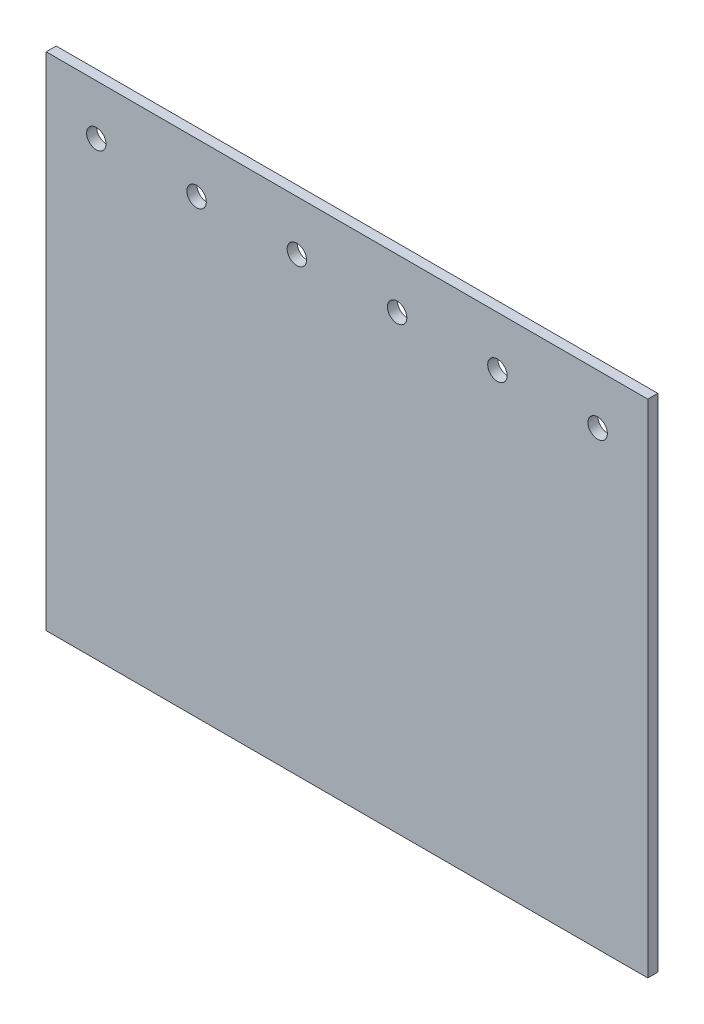
ISO-10303-21;
HEADER;
FILE_DESCRIPTION(('STEP AP214'),'2;1');
FILE_NAME('part.step','',(''),(''),'','','');
FILE_SCHEMA(('AUTOMOTIVE_DESIGN { 1 0 10303 214 1 1 1 1 }'));
ENDSEC;
DATA;
#1=APPLICATION_CONTEXT('core data for automotive mechanical design processes');
#2=APPLICATION_PROTOCOL_DEFINITION('international standard','automotive_design',2000,#1);
#3=PRODUCT_CONTEXT('',#1,'mechanical');
#4=PRODUCT('Part','Part','',(#3));
#5=PRODUCT_RELATED_PRODUCT_CATEGORY('part','',(#4));
#6=PRODUCT_DEFINITION_FORMATION('','',#4);
#7=PRODUCT_DEFINITION_CONTEXT('part definition',#1,'design');
#8=PRODUCT_DEFINITION('design','',#6,#7);
#9=PRODUCT_DEFINITION_SHAPE('','',#8);
#10=(LENGTH_UNIT() NAMED_UNIT(*) SI_UNIT(.MILLI.,.METRE.));
#11=(NAMED_UNIT(*) PLANE_ANGLE_UNIT() SI_UNIT($,.RADIAN.));
#12=(NAMED_UNIT(*) SI_UNIT($,.STERADIAN.) SOLID_ANGLE_UNIT());
#13=UNCERTAINTY_MEASURE_WITH_UNIT(LENGTH_MEASURE(1.E-05),#10,'distance_accuracy_value','');
#14=(GEOMETRIC_REPRESENTATION_CONTEXT(3) GLOBAL_UNCERTAINTY_ASSIGNED_CONTEXT((#13)) GLOBAL_UNIT_ASSIGNED_CONTEXT((#10,
#11,#12)) REPRESENTATION_CONTEXT('',''));
#15=CARTESIAN_POINT('',(0.,0.,0.));
#16=DIRECTION('',(0.,0.,1.));
#17=DIRECTION('',(1.,0.,0.));
#18=AXIS2_PLACEMENT_3D('',#15,#16,#17);
#19=CARTESIAN_POINT('',(0.,0.,2.54));
#20=DIRECTION('',(-1.,0.,0.));
#21=DIRECTION('',(0.,0.,1.));
#22=AXIS2_PLACEMENT_3D('',#19,#20,#21);
#23=PLANE('',#22);
#24=DIRECTION('',(0.,1.,0.));
#25=VECTOR('',#24,1.);
#26=CARTESIAN_POINT('',(0.,0.,0.));
#27=LINE('',#26,#25);
#28=CARTESIAN_POINT('',(0.,0.,0.));
#29=VERTEX_POINT('',#28);
#30=CARTESIAN_POINT('',(0.,127.,0.));
#31=VERTEX_POINT('',#30);
#32=EDGE_CURVE('E107',#29,#31,#27,.T.);
#33=ORIENTED_EDGE('',*,*,#32,.T.);
#34=DIRECTION('',(0.,0.,-1.));
#35=VECTOR('',#34,1.);
#36=CARTESIAN_POINT('',(0.,127.,2.54));
#37=LINE('',#36,#35);
#38=CARTESIAN_POINT('',(0.,127.,2.54));
#39=VERTEX_POINT('',#38);
#40=EDGE_CURVE('E11',#39,#31,#37,.T.);
#41=ORIENTED_EDGE('',*,*,#40,.F.);
#42=DIRECTION('',(0.,1.,0.));
#43=VECTOR('',#42,1.);
#44=CARTESIAN_POINT('',(0.,0.,2.54));
#45=LINE('',#44,#43);
#46=CARTESIAN_POINT('',(0.,0.,2.54));
#47=VERTEX_POINT('',#46);
#48=EDGE_CURVE('E91',#47,#39,#45,.T.);
#49=ORIENTED_EDGE('',*,*,#48,.F.);
#50=DIRECTION('',(0.,0.,-1.));
#51=VECTOR('',#50,1.);
#52=CARTESIAN_POINT('',(0.,0.,2.54));
#53=LINE('',#52,#51);
#54=EDGE_CURVE('E103',#47,#29,#53,.T.);
#55=ORIENTED_EDGE('',*,*,#54,.T.);
#56=EDGE_LOOP('',(#33,#41,#49,#55));
#57=FACE_BOUND('',#56,.T.);
#58=ADVANCED_FACE('F39',(#57),#23,.F.);
#59=CARTESIAN_POINT('',(0.,127.,2.54));
#60=DIRECTION('',(0.,-1.,0.));
#61=DIRECTION('',(1.,0.,0.));
#62=AXIS2_PLACEMENT_3D('',#59,#60,#61);
#63=PLANE('',#62);
#64=DIRECTION('',(-1.,0.,0.));
#65=VECTOR('',#64,1.);
#66=CARTESIAN_POINT('',(0.,127.,0.));
#67=LINE('',#66,#65);
#68=CARTESIAN_POINT('',(-152.4,127.,0.));
#69=VERTEX_POINT('',#68);
#70=EDGE_CURVE('E96',#31,#69,#67,.T.);
#71=ORIENTED_EDGE('',*,*,#70,.T.);
#72=DIRECTION('',(0.,0.,-1.));
#73=VECTOR('',#72,1.);
#74=CARTESIAN_POINT('',(-152.4,127.,2.54));
#75=LINE('',#74,#73);
#76=CARTESIAN_POINT('',(-152.4,127.,2.54));
#77=VERTEX_POINT('',#76);
#78=EDGE_CURVE('E48',#77,#69,#75,.T.);
#79=ORIENTED_EDGE('',*,*,#78,.F.);
#80=DIRECTION('',(-1.,0.,0.));
#81=VECTOR('',#80,1.);
#82=CARTESIAN_POINT('',(0.,127.,2.54));
#83=LINE('',#82,#81);
#84=EDGE_CURVE('E86',#39,#77,#83,.T.);
#85=ORIENTED_EDGE('',*,*,#84,.F.);
#86=ORIENTED_EDGE('',*,*,#40,.T.);
#87=EDGE_LOOP('',(#71,#79,#85,#86));
#88=FACE_BOUND('',#87,.T.);
#89=ADVANCED_FACE('F95',(#88),#63,.F.);
#90=CARTESIAN_POINT('',(-152.4,0.,2.54));
#91=DIRECTION('',(1.,0.,0.));
#92=DIRECTION('',(0.,0.,-1.));
#93=AXIS2_PLACEMENT_3D('',#90,#91,#92);
#94=PLANE('',#93);
#95=DIRECTION('',(0.,-1.,0.));
#96=VECTOR('',#95,1.);
#97=CARTESIAN_POINT('',(-152.4,0.,0.));
#98=LINE('',#97,#96);
#99=CARTESIAN_POINT('',(-152.4,0.,0.));
#100=VERTEX_POINT('',#99);
#101=EDGE_CURVE('E73',#69,#100,#98,.T.);
#102=ORIENTED_EDGE('',*,*,#101,.T.);
#103=DIRECTION('',(0.,0.,-1.));
#104=VECTOR('',#103,1.);
#105=CARTESIAN_POINT('',(-152.4,0.,2.54));
#106=LINE('',#105,#104);
#107=CARTESIAN_POINT('',(-152.4,0.,2.54));
#108=VERTEX_POINT('',#107);
#109=EDGE_CURVE('E98',#108,#100,#106,.T.);
#110=ORIENTED_EDGE('',*,*,#109,.F.);
#111=DIRECTION('',(0.,-1.,0.));
#112=VECTOR('',#111,1.);
#113=CARTESIAN_POINT('',(-152.4,0.,2.54));
#114=LINE('',#113,#112);
#115=EDGE_CURVE('E89',#77,#108,#114,.T.);
#116=ORIENTED_EDGE('',*,*,#115,.F.);
#117=ORIENTED_EDGE('',*,*,#78,.T.);
#118=EDGE_LOOP('',(#102,#110,#116,#117));
#119=FACE_BOUND('',#118,.T.);
#120=ADVANCED_FACE('F99',(#119),#94,.F.);
#121=CARTESIAN_POINT('',(0.,0.,2.54));
#122=DIRECTION('',(0.,1.,0.));
#123=DIRECTION('',(-1.,0.,0.));
#124=AXIS2_PLACEMENT_3D('',#121,#122,#123);
#125=PLANE('',#124);
#126=DIRECTION('',(1.,0.,0.));
#127=VECTOR('',#126,1.);
#128=CARTESIAN_POINT('',(0.,0.,0.));
#129=LINE('',#128,#127);
#130=EDGE_CURVE('E79',#100,#29,#129,.T.);
#131=ORIENTED_EDGE('',*,*,#130,.T.);
#132=ORIENTED_EDGE('',*,*,#54,.F.);
#133=DIRECTION('',(1.,0.,0.));
#134=VECTOR('',#133,1.);
#135=CARTESIAN_POINT('',(0.,0.,2.54));
#136=LINE('',#135,#134);
#137=EDGE_CURVE('E56',#108,#47,#136,.T.);
#138=ORIENTED_EDGE('',*,*,#137,.F.);
#139=ORIENTED_EDGE('',*,*,#109,.T.);
#140=EDGE_LOOP('',(#131,#132,#138,#139));
#141=FACE_BOUND('',#140,.T.);
#142=ADVANCED_FACE('F121',(#141),#125,.F.);
#143=CARTESIAN_POINT('',(0.,0.,2.54));
#144=DIRECTION('',(0.,0.,1.));
#145=DIRECTION('',(1.,0.,0.));
#146=AXIS2_PLACEMENT_3D('',#143,#144,#145);
#147=PLANE('',#146);
#148=CARTESIAN_POINT('',(-139.7,114.3,2.54));
#149=DIRECTION('',(0.,0.,1.));
#150=DIRECTION('',(1.,0.,0.));
#151=AXIS2_PLACEMENT_3D('',#148,#149,#150);
#152=CIRCLE('',#151,2.45745);
#153=CARTESIAN_POINT('',(-137.24255,114.3,2.54));
#154=VERTEX_POINT('',#153);
#155=EDGE_CURVE('E171',#154,#154,#152,.T.);
#156=ORIENTED_EDGE('',*,*,#155,.F.);
#157=EDGE_LOOP('',(#156));
#158=FACE_BOUND('',#157,.T.);
#159=CARTESIAN_POINT('',(-114.3,114.3,2.54));
#160=DIRECTION('',(0.,0.,1.));
#161=DIRECTION('',(1.,0.,0.));
#162=AXIS2_PLACEMENT_3D('',#159,#160,#161);
#163=CIRCLE('',#162,2.45744999999999);
#164=CARTESIAN_POINT('',(-111.84255,114.3,2.54));
#165=VERTEX_POINT('',#164);
#166=EDGE_CURVE('E163',#165,#165,#163,.T.);
#167=ORIENTED_EDGE('',*,*,#166,.F.);
#168=EDGE_LOOP('',(#167));
#169=FACE_BOUND('',#168,.T.);
#170=CARTESIAN_POINT('',(-88.9,114.3,2.54));
#171=DIRECTION('',(0.,0.,1.));
#172=DIRECTION('',(1.,0.,0.));
#173=AXIS2_PLACEMENT_3D('',#170,#171,#172);
#174=CIRCLE('',#173,2.45744999999999);
#175=CARTESIAN_POINT('',(-86.44255,114.3,2.54));
#176=VERTEX_POINT('',#175);
#177=EDGE_CURVE('E155',#176,#176,#174,.T.);
#178=ORIENTED_EDGE('',*,*,#177,.F.);
#179=EDGE_LOOP('',(#178));
#180=FACE_BOUND('',#179,.T.);
#181=CARTESIAN_POINT('',(-63.5,114.3,2.54));
#182=DIRECTION('',(0.,0.,1.));
#183=DIRECTION('',(1.,0.,0.));
#184=AXIS2_PLACEMENT_3D('',#181,#182,#183);
#185=CIRCLE('',#184,2.45744999999999);
#186=CARTESIAN_POINT('',(-61.04255,114.3,2.54));
#187=VERTEX_POINT('',#186);
#188=EDGE_CURVE('E147',#187,#187,#185,.T.);
#189=ORIENTED_EDGE('',*,*,#188,.F.);
#190=EDGE_LOOP('',(#189));
#191=FACE_BOUND('',#190,.T.);
#192=CARTESIAN_POINT('',(-38.1,114.3,2.54));
#193=DIRECTION('',(0.,0.,1.));
#194=DIRECTION('',(1.,0.,0.));
#195=AXIS2_PLACEMENT_3D('',#192,#193,#194);
#196=CIRCLE('',#195,2.45744999999999);
#197=CARTESIAN_POINT('',(-35.64255,114.3,2.54));
#198=VERTEX_POINT('',#197);
#199=EDGE_CURVE('E139',#198,#198,#196,.T.);
#200=ORIENTED_EDGE('',*,*,#199,.F.);
#201=EDGE_LOOP('',(#200));
#202=FACE_BOUND('',#201,.T.);
#203=CARTESIAN_POINT('',(-12.7,114.3,2.54));
#204=DIRECTION('',(0.,0.,1.));
#205=DIRECTION('',(1.,0.,0.));
#206=AXIS2_PLACEMENT_3D('',#203,#204,#205);
#207=CIRCLE('',#206,2.45744999999999);
#208=CARTESIAN_POINT('',(-10.24255,114.3,2.54));
#209=VERTEX_POINT('',#208);
#210=EDGE_CURVE('E131',#209,#209,#207,.T.);
#211=ORIENTED_EDGE('',*,*,#210,.F.);
#212=EDGE_LOOP('',(#211));
#213=FACE_BOUND('',#212,.T.);
#214=ORIENTED_EDGE('',*,*,#48,.T.);
#215=ORIENTED_EDGE('',*,*,#84,.T.);
#216=ORIENTED_EDGE('',*,*,#115,.T.);
#217=ORIENTED_EDGE('',*,*,#137,.T.);
#218=EDGE_LOOP('',(#214,#215,#216,#217));
#219=FACE_BOUND('',#218,.T.);
#220=ADVANCED_FACE('F87',(#158,#169,#180,#191,#202,#213,#219),#147,.T.);
#221=CARTESIAN_POINT('',(0.,0.,0.));
#222=DIRECTION('',(0.,0.,1.));
#223=DIRECTION('',(1.,0.,0.));
#224=AXIS2_PLACEMENT_3D('',#221,#222,#223);
#225=PLANE('',#224);
#226=CARTESIAN_POINT('',(-139.7,114.3,0.));
#227=DIRECTION('',(0.,0.,1.));
#228=DIRECTION('',(1.,0.,0.));
#229=AXIS2_PLACEMENT_3D('',#226,#227,#228);
#230=CIRCLE('',#229,2.45745);
#231=CARTESIAN_POINT('',(-137.24255,114.3,0.));
#232=VERTEX_POINT('',#231);
#233=EDGE_CURVE('E167',#232,#232,#230,.T.);
#234=ORIENTED_EDGE('',*,*,#233,.T.);
#235=EDGE_LOOP('',(#234));
#236=FACE_BOUND('',#235,.T.);
#237=CARTESIAN_POINT('',(-114.3,114.3,0.));
#238=DIRECTION('',(0.,0.,1.));
#239=DIRECTION('',(1.,0.,0.));
#240=AXIS2_PLACEMENT_3D('',#237,#238,#239);
#241=CIRCLE('',#240,2.45745);
#242=CARTESIAN_POINT('',(-111.84255,114.3,0.));
#243=VERTEX_POINT('',#242);
#244=EDGE_CURVE('E159',#243,#243,#241,.T.);
#245=ORIENTED_EDGE('',*,*,#244,.T.);
#246=EDGE_LOOP('',(#245));
#247=FACE_BOUND('',#246,.T.);
#248=CARTESIAN_POINT('',(-88.9,114.3,0.));
#249=DIRECTION('',(0.,0.,1.));
#250=DIRECTION('',(1.,0.,0.));
#251=AXIS2_PLACEMENT_3D('',#248,#249,#250);
#252=CIRCLE('',#251,2.45745);
#253=CARTESIAN_POINT('',(-86.44255,114.3,0.));
#254=VERTEX_POINT('',#253);
#255=EDGE_CURVE('E151',#254,#254,#252,.T.);
#256=ORIENTED_EDGE('',*,*,#255,.T.);
#257=EDGE_LOOP('',(#256));
#258=FACE_BOUND('',#257,.T.);
#259=CARTESIAN_POINT('',(-63.5,114.3,0.));
#260=DIRECTION('',(0.,0.,1.));
#261=DIRECTION('',(1.,0.,0.));
#262=AXIS2_PLACEMENT_3D('',#259,#260,#261);
#263=CIRCLE('',#262,2.45745);
#264=CARTESIAN_POINT('',(-61.04255,114.3,0.));
#265=VERTEX_POINT('',#264);
#266=EDGE_CURVE('E143',#265,#265,#263,.T.);
#267=ORIENTED_EDGE('',*,*,#266,.T.);
#268=EDGE_LOOP('',(#267));
#269=FACE_BOUND('',#268,.T.);
#270=CARTESIAN_POINT('',(-38.1,114.3,0.));
#271=DIRECTION('',(0.,0.,1.));
#272=DIRECTION('',(1.,0.,0.));
#273=AXIS2_PLACEMENT_3D('',#270,#271,#272);
#274=CIRCLE('',#273,2.45744999999999);
#275=CARTESIAN_POINT('',(-35.64255,114.3,0.));
#276=VERTEX_POINT('',#275);
#277=EDGE_CURVE('E135',#276,#276,#274,.T.);
#278=ORIENTED_EDGE('',*,*,#277,.T.);
#279=EDGE_LOOP('',(#278));
#280=FACE_BOUND('',#279,.T.);
#281=CARTESIAN_POINT('',(-12.7,114.3,0.));
#282=DIRECTION('',(0.,0.,1.));
#283=DIRECTION('',(1.,0.,0.));
#284=AXIS2_PLACEMENT_3D('',#281,#282,#283);
#285=CIRCLE('',#284,2.45745);
#286=CARTESIAN_POINT('',(-10.24255,114.3,0.));
#287=VERTEX_POINT('',#286);
#288=EDGE_CURVE('E111',#287,#287,#285,.T.);
#289=ORIENTED_EDGE('',*,*,#288,.T.);
#290=EDGE_LOOP('',(#289));
#291=FACE_BOUND('',#290,.T.);
#292=ORIENTED_EDGE('',*,*,#32,.F.);
#293=ORIENTED_EDGE('',*,*,#130,.F.);
#294=ORIENTED_EDGE('',*,*,#101,.F.);
#295=ORIENTED_EDGE('',*,*,#70,.F.);
#296=EDGE_LOOP('',(#292,#293,#294,#295));
#297=FACE_BOUND('',#296,.T.);
#298=ADVANCED_FACE('F124',(#236,#247,#258,#269,#280,#291,#297),#225,.F.);
#299=CARTESIAN_POINT('',(-12.7,114.3,2.54));
#300=DIRECTION('',(0.,0.,1.));
#301=DIRECTION('',(1.,0.,0.));
#302=AXIS2_PLACEMENT_3D('',#299,#300,#301);
#303=CYLINDRICAL_SURFACE('',#302,2.45744999999999);
#304=ORIENTED_EDGE('',*,*,#288,.F.);
#305=EDGE_LOOP('',(#304));
#306=FACE_BOUND('',#305,.T.);
#307=ORIENTED_EDGE('',*,*,#210,.T.);
#308=EDGE_LOOP('',(#307));
#309=FACE_BOUND('',#308,.T.);
#310=ADVANCED_FACE('F191',(#306,#309),#303,.F.);
#311=CARTESIAN_POINT('',(-38.1,114.3,2.54));
#312=DIRECTION('',(0.,0.,1.));
#313=DIRECTION('',(1.,0.,0.));
#314=AXIS2_PLACEMENT_3D('',#311,#312,#313);
#315=CYLINDRICAL_SURFACE('',#314,2.45744999999999);
#316=ORIENTED_EDGE('',*,*,#277,.F.);
#317=EDGE_LOOP('',(#316));
#318=FACE_BOUND('',#317,.T.);
#319=ORIENTED_EDGE('',*,*,#199,.T.);
#320=EDGE_LOOP('',(#319));
#321=FACE_BOUND('',#320,.T.);
#322=ADVANCED_FACE('F193',(#318,#321),#315,.F.);
#323=CARTESIAN_POINT('',(-63.5,114.3,2.54));
#324=DIRECTION('',(0.,0.,1.));
#325=DIRECTION('',(1.,0.,0.));
#326=AXIS2_PLACEMENT_3D('',#323,#324,#325);
#327=CYLINDRICAL_SURFACE('',#326,2.45744999999999);
#328=ORIENTED_EDGE('',*,*,#266,.F.);
#329=EDGE_LOOP('',(#328));
#330=FACE_BOUND('',#329,.T.);
#331=ORIENTED_EDGE('',*,*,#188,.T.);
#332=EDGE_LOOP('',(#331));
#333=FACE_BOUND('',#332,.T.);
#334=ADVANCED_FACE('F200',(#330,#333),#327,.F.);
#335=CARTESIAN_POINT('',(-88.9,114.3,2.54));
#336=DIRECTION('',(0.,0.,1.));
#337=DIRECTION('',(1.,0.,0.));
#338=AXIS2_PLACEMENT_3D('',#335,#336,#337);
#339=CYLINDRICAL_SURFACE('',#338,2.45744999999999);
#340=ORIENTED_EDGE('',*,*,#255,.F.);
#341=EDGE_LOOP('',(#340));
#342=FACE_BOUND('',#341,.T.);
#343=ORIENTED_EDGE('',*,*,#177,.T.);
#344=EDGE_LOOP('',(#343));
#345=FACE_BOUND('',#344,.T.);
#346=ADVANCED_FACE('F247',(#342,#345),#339,.F.);
#347=CARTESIAN_POINT('',(-114.3,114.3,2.54));
#348=DIRECTION('',(0.,0.,1.));
#349=DIRECTION('',(1.,0.,0.));
#350=AXIS2_PLACEMENT_3D('',#347,#348,#349);
#351=CYLINDRICAL_SURFACE('',#350,2.45744999999999);
#352=ORIENTED_EDGE('',*,*,#244,.F.);
#353=EDGE_LOOP('',(#352));
#354=FACE_BOUND('',#353,.T.);
#355=ORIENTED_EDGE('',*,*,#166,.T.);
#356=EDGE_LOOP('',(#355));
#357=FACE_BOUND('',#356,.T.);
#358=ADVANCED_FACE('F257',(#354,#357),#351,.F.);
#359=CARTESIAN_POINT('',(-139.7,114.3,2.54));
#360=DIRECTION('',(0.,0.,1.));
#361=DIRECTION('',(1.,0.,0.));
#362=AXIS2_PLACEMENT_3D('',#359,#360,#361);
#363=CYLINDRICAL_SURFACE('',#362,2.45745);
#364=ORIENTED_EDGE('',*,*,#233,.F.);
#365=EDGE_LOOP('',(#364));
#366=FACE_BOUND('',#365,.T.);
#367=ORIENTED_EDGE('',*,*,#155,.T.);
#368=EDGE_LOOP('',(#367));
#369=FACE_BOUND('',#368,.T.);
#370=ADVANCED_FACE('F176',(#366,#369),#363,.F.);
#371=CLOSED_SHELL('',(#58,#89,#120,#142,#220,#298,#310,#322,#334,#346,#358,#370));
#372=MANIFOLD_SOLID_BREP('B2',#371);
#373=ADVANCED_BREP_SHAPE_REPRESENTATION('',(#18,#372),#14);
#374=SHAPE_DEFINITION_REPRESENTATION(#9,#373);
ENDSEC;
END-ISO-10303-21;
